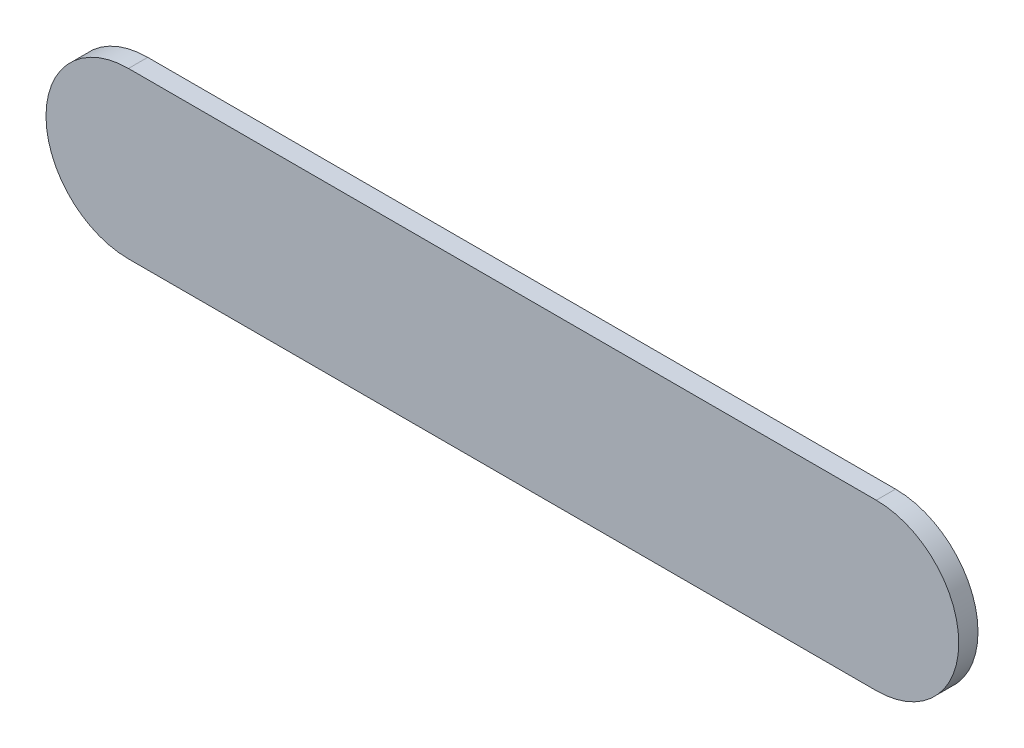
ISO-10303-21;
HEADER;
FILE_DESCRIPTION(('STEP AP214'),'2;1');
FILE_NAME('part.step','',(''),(''),'','','');
FILE_SCHEMA(('AUTOMOTIVE_DESIGN { 1 0 10303 214 1 1 1 1 }'));
ENDSEC;
DATA;
#1=APPLICATION_CONTEXT('core data for automotive mechanical design processes');
#2=APPLICATION_PROTOCOL_DEFINITION('international standard','automotive_design',2000,#1);
#3=PRODUCT_CONTEXT('',#1,'mechanical');
#4=PRODUCT('Part','Part','',(#3));
#5=PRODUCT_RELATED_PRODUCT_CATEGORY('part','',(#4));
#6=PRODUCT_DEFINITION_FORMATION('','',#4);
#7=PRODUCT_DEFINITION_CONTEXT('part definition',#1,'design');
#8=PRODUCT_DEFINITION('design','',#6,#7);
#9=PRODUCT_DEFINITION_SHAPE('','',#8);
#10=(LENGTH_UNIT() NAMED_UNIT(*) SI_UNIT(.MILLI.,.METRE.));
#11=(NAMED_UNIT(*) PLANE_ANGLE_UNIT() SI_UNIT($,.RADIAN.));
#12=(NAMED_UNIT(*) SI_UNIT($,.STERADIAN.) SOLID_ANGLE_UNIT());
#13=UNCERTAINTY_MEASURE_WITH_UNIT(LENGTH_MEASURE(1.E-05),#10,'distance_accuracy_value','');
#14=(GEOMETRIC_REPRESENTATION_CONTEXT(3) GLOBAL_UNCERTAINTY_ASSIGNED_CONTEXT((#13)) GLOBAL_UNIT_ASSIGNED_CONTEXT((#10,
#11,#12)) REPRESENTATION_CONTEXT('',''));
#15=CARTESIAN_POINT('',(0.,0.,0.));
#16=DIRECTION('',(0.,0.,1.));
#17=DIRECTION('',(1.,0.,0.));
#18=AXIS2_PLACEMENT_3D('',#15,#16,#17);
#19=CARTESIAN_POINT('',(106.44,-127.66,1.635));
#20=DIRECTION('',(0.,0.,1.));
#21=DIRECTION('',(1.,0.,0.));
#22=AXIS2_PLACEMENT_3D('',#19,#20,#21);
#23=PLANE('',#22);
#24=DIRECTION('',(1.,0.,0.));
#25=VECTOR('',#24,1.);
#26=CARTESIAN_POINT('',(106.44,-127.66,1.635));
#27=LINE('',#26,#25);
#28=CARTESIAN_POINT('',(106.44,-127.66,1.635));
#29=VERTEX_POINT('',#28);
#30=CARTESIAN_POINT('',(107.8,-127.66,1.635));
#31=VERTEX_POINT('',#30);
#32=EDGE_CURVE('E99',#29,#31,#27,.T.);
#33=ORIENTED_EDGE('',*,*,#32,.T.);
#34=CARTESIAN_POINT('',(107.8,-127.51,1.635));
#35=DIRECTION('',(0.,0.,1.));
#36=DIRECTION('',(0.,-1.,0.));
#37=AXIS2_PLACEMENT_3D('',#34,#35,#36);
#38=CIRCLE('',#37,0.15);
#39=CARTESIAN_POINT('',(107.8,-127.36,1.635));
#40=VERTEX_POINT('',#39);
#41=EDGE_CURVE('E78',#31,#40,#38,.T.);
#42=ORIENTED_EDGE('',*,*,#41,.T.);
#43=DIRECTION('',(-1.,0.,0.));
#44=VECTOR('',#43,1.);
#45=CARTESIAN_POINT('',(107.8,-127.36,1.635));
#46=LINE('',#45,#44);
#47=CARTESIAN_POINT('',(106.44,-127.36,1.635));
#48=VERTEX_POINT('',#47);
#49=EDGE_CURVE('E83',#40,#48,#46,.T.);
#50=ORIENTED_EDGE('',*,*,#49,.T.);
#51=CARTESIAN_POINT('',(106.44,-127.51,1.635));
#52=DIRECTION('',(0.,0.,1.));
#53=DIRECTION('',(0.,1.,0.));
#54=AXIS2_PLACEMENT_3D('',#51,#52,#53);
#55=CIRCLE('',#54,0.15);
#56=EDGE_CURVE('E11',#48,#29,#55,.T.);
#57=ORIENTED_EDGE('',*,*,#56,.T.);
#58=EDGE_LOOP('',(#33,#42,#50,#57));
#59=FACE_BOUND('',#58,.T.);
#60=ADVANCED_FACE('F17',(#59),#23,.T.);
#61=CARTESIAN_POINT('',(106.44,-127.66,1.6));
#62=DIRECTION('',(0.,0.,1.));
#63=DIRECTION('',(1.,0.,0.));
#64=AXIS2_PLACEMENT_3D('',#61,#62,#63);
#65=PLANE('',#64);
#66=CARTESIAN_POINT('',(106.44,-127.51,1.6));
#67=DIRECTION('',(0.,0.,1.));
#68=DIRECTION('',(0.,1.,0.));
#69=AXIS2_PLACEMENT_3D('',#66,#67,#68);
#70=CIRCLE('',#69,0.15);
#71=CARTESIAN_POINT('',(106.44,-127.36,1.6));
#72=VERTEX_POINT('',#71);
#73=CARTESIAN_POINT('',(106.44,-127.66,1.6));
#74=VERTEX_POINT('',#73);
#75=EDGE_CURVE('E26',#72,#74,#70,.T.);
#76=ORIENTED_EDGE('',*,*,#75,.F.);
#77=DIRECTION('',(-1.,0.,0.));
#78=VECTOR('',#77,1.);
#79=CARTESIAN_POINT('',(107.8,-127.36,1.6));
#80=LINE('',#79,#78);
#81=CARTESIAN_POINT('',(107.8,-127.36,1.6));
#82=VERTEX_POINT('',#81);
#83=EDGE_CURVE('E66',#82,#72,#80,.T.);
#84=ORIENTED_EDGE('',*,*,#83,.F.);
#85=CARTESIAN_POINT('',(107.8,-127.51,1.6));
#86=DIRECTION('',(0.,0.,1.));
#87=DIRECTION('',(0.,-1.,0.));
#88=AXIS2_PLACEMENT_3D('',#85,#86,#87);
#89=CIRCLE('',#88,0.15);
#90=CARTESIAN_POINT('',(107.8,-127.66,1.6));
#91=VERTEX_POINT('',#90);
#92=EDGE_CURVE('E71',#91,#82,#89,.T.);
#93=ORIENTED_EDGE('',*,*,#92,.F.);
#94=DIRECTION('',(1.,0.,0.));
#95=VECTOR('',#94,1.);
#96=CARTESIAN_POINT('',(106.44,-127.66,1.6));
#97=LINE('',#96,#95);
#98=EDGE_CURVE('E114',#74,#91,#97,.T.);
#99=ORIENTED_EDGE('',*,*,#98,.F.);
#100=EDGE_LOOP('',(#76,#84,#93,#99));
#101=FACE_BOUND('',#100,.T.);
#102=ADVANCED_FACE('F68',(#101),#65,.F.);
#103=CARTESIAN_POINT('',(106.44,-127.51,1.6));
#104=DIRECTION('',(0.,0.,-1.));
#105=DIRECTION('',(0.,1.,0.));
#106=AXIS2_PLACEMENT_3D('',#103,#104,#105);
#107=CYLINDRICAL_SURFACE('',#106,0.15);
#108=ORIENTED_EDGE('',*,*,#75,.T.);
#109=DIRECTION('',(0.,0.,1.));
#110=VECTOR('',#109,1.);
#111=CARTESIAN_POINT('',(106.44,-127.66,1.6));
#112=LINE('',#111,#110);
#113=EDGE_CURVE('E93',#74,#29,#112,.T.);
#114=ORIENTED_EDGE('',*,*,#113,.T.);
#115=ORIENTED_EDGE('',*,*,#56,.F.);
#116=DIRECTION('',(0.,0.,1.));
#117=VECTOR('',#116,1.);
#118=CARTESIAN_POINT('',(106.44,-127.36,1.6));
#119=LINE('',#118,#117);
#120=EDGE_CURVE('E77',#72,#48,#119,.T.);
#121=ORIENTED_EDGE('',*,*,#120,.F.);
#122=EDGE_LOOP('',(#108,#114,#115,#121));
#123=FACE_BOUND('',#122,.T.);
#124=ADVANCED_FACE('F110',(#123),#107,.T.);
#125=CARTESIAN_POINT('',(107.8,-127.36,1.6));
#126=DIRECTION('',(0.,-1.,0.));
#127=DIRECTION('',(0.,0.,-1.));
#128=AXIS2_PLACEMENT_3D('',#125,#126,#127);
#129=PLANE('',#128);
#130=ORIENTED_EDGE('',*,*,#83,.T.);
#131=ORIENTED_EDGE('',*,*,#120,.T.);
#132=ORIENTED_EDGE('',*,*,#49,.F.);
#133=DIRECTION('',(0.,0.,1.));
#134=VECTOR('',#133,1.);
#135=CARTESIAN_POINT('',(107.8,-127.36,1.6));
#136=LINE('',#135,#134);
#137=EDGE_CURVE('E81',#82,#40,#136,.T.);
#138=ORIENTED_EDGE('',*,*,#137,.F.);
#139=EDGE_LOOP('',(#130,#131,#132,#138));
#140=FACE_BOUND('',#139,.T.);
#141=ADVANCED_FACE('F82',(#140),#129,.F.);
#142=CARTESIAN_POINT('',(107.8,-127.51,1.6));
#143=DIRECTION('',(0.,0.,-1.));
#144=DIRECTION('',(0.,-1.,0.));
#145=AXIS2_PLACEMENT_3D('',#142,#143,#144);
#146=CYLINDRICAL_SURFACE('',#145,0.15);
#147=ORIENTED_EDGE('',*,*,#92,.T.);
#148=ORIENTED_EDGE('',*,*,#137,.T.);
#149=ORIENTED_EDGE('',*,*,#41,.F.);
#150=DIRECTION('',(0.,0.,1.));
#151=VECTOR('',#150,1.);
#152=CARTESIAN_POINT('',(107.8,-127.66,1.6));
#153=LINE('',#152,#151);
#154=EDGE_CURVE('E90',#91,#31,#153,.T.);
#155=ORIENTED_EDGE('',*,*,#154,.F.);
#156=EDGE_LOOP('',(#147,#148,#149,#155));
#157=FACE_BOUND('',#156,.T.);
#158=ADVANCED_FACE('F88',(#157),#146,.T.);
#159=CARTESIAN_POINT('',(106.44,-127.66,1.6));
#160=DIRECTION('',(0.,1.,0.));
#161=DIRECTION('',(1.,0.,0.));
#162=AXIS2_PLACEMENT_3D('',#159,#160,#161);
#163=PLANE('',#162);
#164=ORIENTED_EDGE('',*,*,#98,.T.);
#165=ORIENTED_EDGE('',*,*,#154,.T.);
#166=ORIENTED_EDGE('',*,*,#32,.F.);
#167=ORIENTED_EDGE('',*,*,#113,.F.);
#168=EDGE_LOOP('',(#164,#165,#166,#167));
#169=FACE_BOUND('',#168,.T.);
#170=ADVANCED_FACE('F113',(#169),#163,.F.);
#171=CLOSED_SHELL('',(#60,#102,#124,#141,#158,#170));
#172=MANIFOLD_SOLID_BREP('B1',#171);
#173=ADVANCED_BREP_SHAPE_REPRESENTATION('',(#18,#172),#14);
#174=SHAPE_DEFINITION_REPRESENTATION(#9,#173);
ENDSEC;
END-ISO-10303-21;
